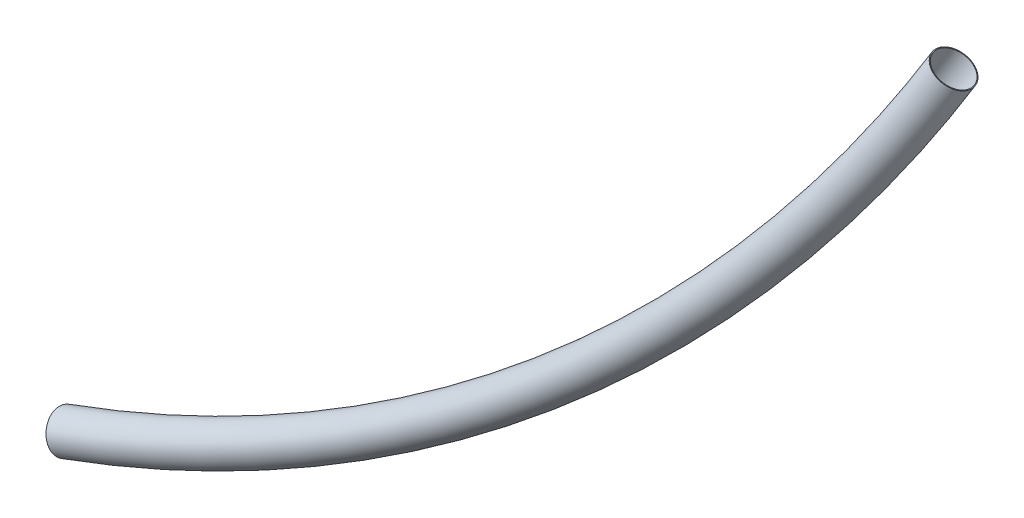
ISO-10303-21;
HEADER;
FILE_DESCRIPTION(('STEP AP214'),'2;1');
FILE_NAME('part.step','',(''),(''),'','','');
FILE_SCHEMA(('AUTOMOTIVE_DESIGN { 1 0 10303 214 1 1 1 1 }'));
ENDSEC;
DATA;
#1=APPLICATION_CONTEXT('core data for automotive mechanical design processes');
#2=APPLICATION_PROTOCOL_DEFINITION('international standard','automotive_design',2000,#1);
#3=PRODUCT_CONTEXT('',#1,'mechanical');
#4=PRODUCT('Part','Part','',(#3));
#5=PRODUCT_RELATED_PRODUCT_CATEGORY('part','',(#4));
#6=PRODUCT_DEFINITION_FORMATION('','',#4);
#7=PRODUCT_DEFINITION_CONTEXT('part definition',#1,'design');
#8=PRODUCT_DEFINITION('design','',#6,#7);
#9=PRODUCT_DEFINITION_SHAPE('','',#8);
#10=(LENGTH_UNIT() NAMED_UNIT(*) SI_UNIT(.MILLI.,.METRE.));
#11=(NAMED_UNIT(*) PLANE_ANGLE_UNIT() SI_UNIT($,.RADIAN.));
#12=(NAMED_UNIT(*) SI_UNIT($,.STERADIAN.) SOLID_ANGLE_UNIT());
#13=UNCERTAINTY_MEASURE_WITH_UNIT(LENGTH_MEASURE(1.E-05),#10,'distance_accuracy_value','');
#14=(GEOMETRIC_REPRESENTATION_CONTEXT(3) GLOBAL_UNCERTAINTY_ASSIGNED_CONTEXT((#13)) GLOBAL_UNIT_ASSIGNED_CONTEXT((#10,
#11,#12)) REPRESENTATION_CONTEXT('',''));
#15=CARTESIAN_POINT('',(0.,0.,0.));
#16=DIRECTION('',(0.,0.,1.));
#17=DIRECTION('',(1.,0.,0.));
#18=AXIS2_PLACEMENT_3D('',#15,#16,#17);
#19=CARTESIAN_POINT('',(3164.51677251035,1114.49605303357,-224.2312287669));
#20=DIRECTION('',(0.941114351142538,0.331446569951202,-0.0666854507455971));
#21=DIRECTION('',(-0.332186000076311,0.943213900106069,0.));
#22=AXIS2_PLACEMENT_3D('',#19,#20,#21);
#23=PLANE('',#22);
#24=CARTESIAN_POINT('',(5217.79586572238,-3918.39079524379,3738.21238905892));
#25=CARTESIAN_POINT('',(5217.55665921907,-3917.55131489414,3739.00899774483));
#26=CARTESIAN_POINT('',(5217.32420216601,-3916.72731941726,3739.82389522538));
#27=CARTESIAN_POINT('',(5216.87316353951,-3915.11163415833,3741.48894227291));
#28=CARTESIAN_POINT('',(5216.65458293209,-3914.31994662677,3742.33909428736));
#29=CARTESIAN_POINT('',(5216.23167087354,-3912.77022378343,3744.07323137316));
#30=CARTESIAN_POINT('',(5216.0273420101,-3912.01219459205,3744.95722254381));
#31=CARTESIAN_POINT('',(5215.63332083363,-3910.53121536967,3746.75741281405));
#32=CARTESIAN_POINT('',(5215.44362987597,-3909.80826858935,3747.67361488474));
#33=CARTESIAN_POINT('',(5215.07905936724,-3908.39810402484,3749.5374647773));
#34=CARTESIAN_POINT('',(5214.90419498258,-3907.71092309718,3750.48514345084));
#35=CARTESIAN_POINT('',(5214.56978849253,-3906.37423876022,3752.40947162517));
#36=CARTESIAN_POINT('',(5214.41024782379,-3905.72473888593,3753.38612383114));
#37=CARTESIAN_POINT('',(5214.10681643023,-3904.46474547891,3755.36641866862));
#38=CARTESIAN_POINT('',(5213.96292320998,-3903.85424573296,3756.37005696452));
#39=CARTESIAN_POINT('',(5213.69100168547,-3902.67317293863,3758.40278338273));
#40=CARTESIAN_POINT('',(5213.56297486656,-3902.10260363057,3759.43187387699));
#41=CARTESIAN_POINT('',(5213.32309411362,-3901.00276367308,3761.51303192115));
#42=CARTESIAN_POINT('',(5213.2112316524,-3900.47347131716,3762.56508701687));
#43=CARTESIAN_POINT('',(5213.00378901596,-3899.45674641698,3764.69092911541));
#44=CARTESIAN_POINT('',(5212.90821036487,-3898.9693177932,3765.76471814196));
#45=CARTESIAN_POINT('',(5212.73352568498,-3898.03728081205,3767.93194052229));
#46=CARTESIAN_POINT('',(5212.6544183764,-3897.59266912937,3769.0253723427));
#47=CARTESIAN_POINT('',(5212.51280166729,-3896.74697742373,3771.23011259891));
#48=CARTESIAN_POINT('',(5212.4502938201,-3896.34590147684,3772.34142269741));
#49=CARTESIAN_POINT('',(5212.34201686091,-3895.58817186547,3774.57948030643));
#50=CARTESIAN_POINT('',(5212.29624193233,-3895.23150279304,3775.70622231103));
#51=CARTESIAN_POINT('',(5212.22147714487,-3894.56304467384,3777.9735225188));
#52=CARTESIAN_POINT('',(5212.19248885653,-3894.25125982842,3779.11408200453));
#53=CARTESIAN_POINT('',(5212.13080980198,-3893.38418690857,3782.55323251197));
#54=CARTESIAN_POINT('',(5212.12337519637,-3892.89697285342,3784.86990896316));
#55=CARTESIAN_POINT('',(5212.17597151394,-3892.1080850363,3789.53319468544));
#56=CARTESIAN_POINT('',(5212.23599215283,-3891.80638300184,3791.87979933973));
#57=CARTESIAN_POINT('',(5212.4230430332,-3891.39043235887,3796.58699826067));
#58=CARTESIAN_POINT('',(5212.55007333091,-3891.27618390765,3798.94759253906));
#59=CARTESIAN_POINT('',(5212.87025002029,-3891.23598445387,3803.66596580989));
#60=CARTESIAN_POINT('',(5213.0633989075,-3891.3100405592,3806.0237446927));
#61=CARTESIAN_POINT('',(5213.51443582229,-3891.64592628545,3810.71965868966));
#62=CARTESIAN_POINT('',(5213.77232383531,-3891.90775586409,3813.05779380822));
#63=CARTESIAN_POINT('',(5214.35096206142,-3892.6172714738,3817.69745988362));
#64=CARTESIAN_POINT('',(5214.67170339615,-3893.06493126535,3819.99899596068));
#65=CARTESIAN_POINT('',(5215.37378784331,-3894.14291170517,3824.54944626565));
#66=CARTESIAN_POINT('',(5215.75513094914,-3894.77323233354,3826.7983604993));
#67=CARTESIAN_POINT('',(5216.57570356685,-3896.21204027504,3831.22758316114));
#68=CARTESIAN_POINT('',(5217.0149329743,-3897.02052726673,3833.4078917131));
#69=CARTESIAN_POINT('',(5217.94815261543,-3898.80990813031,3837.68442046518));
#70=CARTESIAN_POINT('',(5218.44214285907,-3899.7908020336,3839.78064064999));
#71=CARTESIAN_POINT('',(5219.48146018297,-3901.91819725756,3843.87446615381));
#72=CARTESIAN_POINT('',(5220.02679623005,-3903.06472752307,3845.87205415488));
#73=CARTESIAN_POINT('',(5221.16485170614,-3905.51510272457,3849.75403864214));
#74=CARTESIAN_POINT('',(5221.75757113807,-3906.81894767022,3851.63843512138));
#75=CARTESIAN_POINT('',(5222.98617713333,-3909.57467152543,3855.28066160073));
#76=CARTESIAN_POINT('',(5223.62206367696,-3911.02655036744,3857.03849165861));
#77=CARTESIAN_POINT('',(5224.93248297532,-3914.06801399515,3860.41511606687));
#78=CARTESIAN_POINT('',(5225.6070157412,-3915.65759882061,3862.0339103771));
#79=CARTESIAN_POINT('',(5226.99020246938,-3918.9638147838,3865.12158448569));
#80=CARTESIAN_POINT('',(5227.69886959716,-3920.68049508104,3866.59040574752));
#81=CARTESIAN_POINT('',(5229.14504375381,-3924.22814694795,3869.3669965681));
#82=CARTESIAN_POINT('',(5229.88255078925,-3926.05911854363,3870.67476609019));
#83=CARTESIAN_POINT('',(5231.38116523893,-3929.82234089505,3873.11998349902));
#84=CARTESIAN_POINT('',(5232.14227272124,-3931.75459194293,3874.25743089444));
#85=CARTESIAN_POINT('',(5233.68267854666,-3935.70663642623,3876.35393678954));
#86=CARTESIAN_POINT('',(5234.46197689459,-3937.72642988485,3877.31299524195));
#87=CARTESIAN_POINT('',(5236.0335652489,-3941.84008941756,3879.04629704871));
#88=CARTESIAN_POINT('',(5236.82586066394,-3943.93398677182,3879.82046126229));
#89=CARTESIAN_POINT('',(5238.41748721693,-3948.18015364221,3881.1779559637));
#90=CARTESIAN_POINT('',(5239.2168183569,-3950.33242317508,3881.76128639677));
#91=CARTESIAN_POINT('',(5240.81683731912,-3954.68004133252,3882.73297783751));
#92=CARTESIAN_POINT('',(5241.61752514288,-3956.87539000487,3883.12133862889));
#93=CARTESIAN_POINT('',(5243.21456773412,-3961.29356517847,3883.70033591894));
#94=CARTESIAN_POINT('',(5244.01092250107,-3963.51639168311,3883.89097239324));
#95=CARTESIAN_POINT('',(5245.59386101604,-3967.97434897211,3884.07319356518));
#96=CARTESIAN_POINT('',(5246.38044199029,-3970.2094830008,3884.06472299209));
#97=CARTESIAN_POINT('',(5247.93801588649,-3974.67555400033,3883.84865236329));
#98=CARTESIAN_POINT('',(5248.70900880499,-3976.90649097025,3883.64105226352));
#99=CARTESIAN_POINT('',(5250.22992552271,-3981.34830907091,3883.02819258546));
#100=CARTESIAN_POINT('',(5250.97984930776,-3983.55919018816,3882.62293287427));
#101=CARTESIAN_POINT('',(5252.45329447992,-3987.94517531488,3881.6176261962));
#102=CARTESIAN_POINT('',(5253.17681586883,-3990.12027932679,3881.01757924258));
#103=CARTESIAN_POINT('',(5254.59231688713,-3994.41926279779,3879.62694601866));
#104=CARTESIAN_POINT('',(5255.28429621408,-3996.54314176562,3878.8363579218));
#105=CARTESIAN_POINT('',(5256.63178224244,-4000.72454549194,3877.0702532903));
#106=CARTESIAN_POINT('',(5257.28728894169,-4002.78207024649,3876.09473674464));
#107=CARTESIAN_POINT('',(5258.55716348997,-4006.81612327564,3873.96569845536));
#108=CARTESIAN_POINT('',(5259.17153136712,-4008.7926516056,3872.81217683342));
#109=CARTESIAN_POINT('',(5260.35475391683,-4012.65064365586,3870.33531706893));
#110=CARTESIAN_POINT('',(5260.92360859969,-4014.53210739766,3869.01197896482));
#111=CARTESIAN_POINT('',(5262.01161266959,-4018.18610371434,3866.20524527103));
#112=CARTESIAN_POINT('',(5262.53077476821,-4019.95866410539,3864.72189082186));
#113=CARTESIAN_POINT('',(5263.51586033485,-4023.38275753947,3861.60538103261));
#114=CARTESIAN_POINT('',(5263.98178380947,-4025.03429059749,3859.97222571109));
#115=CARTESIAN_POINT('',(5264.85707058478,-4028.20456300455,3856.5677204258));
#116=CARTESIAN_POINT('',(5265.26643396903,-4029.72330254974,3854.79637066616));
#117=CARTESIAN_POINT('',(5266.02568197797,-4032.61716795099,3851.12806579413));
#118=CARTESIAN_POINT('',(5266.37556661958,-4033.99229384796,3849.23111071751));
#119=CARTESIAN_POINT('',(5267.01323057268,-4036.58859962467,3845.32588185789));
#120=CARTESIAN_POINT('',(5267.30103514257,-4037.80984203029,3843.31765376792));
#121=CARTESIAN_POINT('',(5267.81266642704,-4040.09033371745,3839.20344894313));
#122=CARTESIAN_POINT('',(5268.03649315767,-4041.14958303961,3837.09747223281));
#123=CARTESIAN_POINT('',(5268.41857057687,-4043.09853684426,3832.80274965267));
#124=CARTESIAN_POINT('',(5268.57682138856,-4043.98824164506,3830.61400393824));
#125=CARTESIAN_POINT('',(5268.82661678783,-4045.59176566423,3826.16930876747));
#126=CARTESIAN_POINT('',(5268.91816139022,-4046.30558492166,3823.91335932606));
#127=CARTESIAN_POINT('',(5269.03386696618,-4047.55200882966,3819.3511835056));
#128=CARTESIAN_POINT('',(5269.05805376328,-4048.08468285862,3817.04497673598));
#129=CARTESIAN_POINT('',(5269.03894289065,-4048.96539869367,3812.39784972914));
#130=CARTESIAN_POINT('',(5268.99564523908,-4049.31344054943,3810.05692950125));
#131=CARTESIAN_POINT('',(5268.84187193052,-4049.82241225028,3805.35702587234));
#132=CARTESIAN_POINT('',(5268.73139632919,-4049.98334225038,3802.9980424863));
#133=CARTESIAN_POINT('',(5268.44405255539,-4050.11694514484,3798.27878863386));
#134=CARTESIAN_POINT('',(5268.26718438725,-4050.08961805144,3795.91851816755));
#135=CARTESIAN_POINT('',(5267.84835547657,-4049.84692744374,3791.2139397996));
#136=CARTESIAN_POINT('',(5267.6064075266,-4049.63160086537,3788.86962885358));
#137=CARTESIAN_POINT('',(5267.05912554412,-4049.01449790838,3784.21316682228));
#138=CARTESIAN_POINT('',(5266.75379152263,-4048.6127215622,3781.9010157314));
#139=CARTESIAN_POINT('',(5266.08191128536,-4047.6255845576,3777.32531059808));
#140=CARTESIAN_POINT('',(5265.71536514651,-4047.04022412989,3775.06175649457));
#141=CARTESIAN_POINT('',(5264.92366952792,-4045.69009088041,3770.59932772573));
#142=CARTESIAN_POINT('',(5264.49852004137,-4044.92531803777,3768.40045306792));
#143=CARTESIAN_POINT('',(5263.59261081217,-4043.22174699156,3764.08284865379));
#144=CARTESIAN_POINT('',(5263.11184704444,-4042.28293618903,3761.96412471314));
#145=CARTESIAN_POINT('',(5262.09815552184,-4040.23801287565,3757.82203946922));
#146=CARTESIAN_POINT('',(5261.56522776715,-4039.13190036537,3755.79867816564));
#147=CARTESIAN_POINT('',(5260.45099835906,-4036.76024583192,3751.86167956609));
#148=CARTESIAN_POINT('',(5259.86969657396,-4035.49470337468,3749.94804256887));
#149=CARTESIAN_POINT('',(5258.66285475245,-4032.81319792177,3746.24408060497));
#150=CARTESIAN_POINT('',(5258.03731470487,-4031.39723488811,3744.45375566942));
#151=CARTESIAN_POINT('',(5256.74624303329,-4028.42449858812,3741.00858395789));
#152=CARTESIAN_POINT('',(5256.08069903616,-4026.86768168,3739.35377947585));
#153=CARTESIAN_POINT('',(5254.71452860915,-4023.62468935022,3736.19201167612));
#154=CARTESIAN_POINT('',(5254.01390217338,-4021.93851390679,3734.6850483833));
#155=CARTESIAN_POINT('',(5252.58254483686,-4018.44878954838,3731.82964648971));
#156=CARTESIAN_POINT('',(5251.85181382504,-4016.64524020026,3730.48120847397));
#157=CARTESIAN_POINT('',(5250.36544265927,-4012.93359493525,3727.95242383837));
#158=CARTESIAN_POINT('',(5249.6098024988,-4011.02549899093,3726.77207726262));
#159=CARTESIAN_POINT('',(5248.07864300981,-4007.11745640241,3724.5873599644));
#160=CARTESIAN_POINT('',(5247.30311507643,-4005.11746969299,3723.58306693974));
#161=CARTESIAN_POINT('',(5245.73801478032,-4001.04065195217,3721.75821471527));
#162=CARTESIAN_POINT('',(5244.94844241107,-3998.96382088505,3720.93765560088));
#163=CARTESIAN_POINT('',(5243.36088378942,-3994.74812612301,3719.48611508947));
#164=CARTESIAN_POINT('',(5242.56289785091,-3992.60926473709,3718.85512664584));
#165=CARTESIAN_POINT('',(5240.96418944627,-3988.28473797166,3717.78715966001));
#166=CARTESIAN_POINT('',(5240.1634669824,-3986.09907263071,3717.35018095797));
#167=CARTESIAN_POINT('',(5238.56464022608,-3981.69553685328,3716.67324204897));
#168=CARTESIAN_POINT('',(5237.76653661871,-3979.47765870375,3716.43332984639));
#169=CARTESIAN_POINT('',(5236.57602089142,-3976.13968267099,3716.22262827033));
#170=CARTESIAN_POINT('',(5236.18023535216,-3975.02501125981,3716.17725952676));
#171=CARTESIAN_POINT('',(5235.39152460667,-3972.7937750023,3716.13630010989));
#172=CARTESIAN_POINT('',(5234.99859913653,-3971.67721034269,3716.14070478407));
#173=CARTESIAN_POINT('',(5234.21616766826,-3969.4437737289,3716.19929959328));
#174=CARTESIAN_POINT('',(5233.82666291276,-3968.32690180365,3716.25350712157));
#175=CARTESIAN_POINT('',(5233.05193160736,-3966.09530570706,3716.41162439945));
#176=CARTESIAN_POINT('',(5232.6667046609,-3964.98058134469,3716.51552950189));
#177=CARTESIAN_POINT('',(5231.90114966703,-3962.75507797387,3716.77286700444));
#178=CARTESIAN_POINT('',(5231.52082200284,-3961.64429927892,3716.92630325461));
#179=CARTESIAN_POINT('',(5230.76580721446,-3959.42885169226,3717.28241167968));
#180=CARTESIAN_POINT('',(5230.39111956618,-3958.32418223896,3717.48507924934));
#181=CARTESIAN_POINT('',(5229.64776610637,-3956.12207597441,3717.93945061091));
#182=CARTESIAN_POINT('',(5229.27910449483,-3955.02464450114,3718.19118714494));
#183=CARTESIAN_POINT('',(5228.54875108693,-3952.83981846927,3718.7431369362));
#184=CARTESIAN_POINT('',(5228.18705864176,-3951.75242298132,3719.0433456562));
#185=CARTESIAN_POINT('',(5227.47119486223,-3949.58932769875,3719.69177548646));
#186=CARTESIAN_POINT('',(5227.11702474194,-3948.51362980554,3720.04000428));
#187=CARTESIAN_POINT('',(5226.41692925554,-3946.37612328186,3720.78378415323));
#188=CARTESIAN_POINT('',(5226.07100311972,-3945.31431335894,3721.17933079413));
#189=CARTESIAN_POINT('',(5225.38832380017,-3943.2074398719,3722.01664515749));
#190=CARTESIAN_POINT('',(5225.05156167186,-3942.16236042066,3722.45836561128));
#191=CARTESIAN_POINT('',(5224.38747620881,-3940.08980270495,3723.38753060221));
#192=CARTESIAN_POINT('',(5224.06015200304,-3939.06232281979,3723.87497090209));
#193=CARTESIAN_POINT('',(5223.4155490128,-3937.02687153555,3724.89465691752));
#194=CARTESIAN_POINT('',(5223.09826841229,-3936.01889662263,3725.42689446864));
#195=CARTESIAN_POINT('',(5222.47428249386,-3934.02414488873,3726.53525493616));
#196=CARTESIAN_POINT('',(5222.16757643973,-3933.0373665938,3727.11137478837));
#197=CARTESIAN_POINT('',(5221.48982875125,-3930.84238800778,3728.45619658036));
#198=CARTESIAN_POINT('',(5221.12190718842,-3929.64061230671,3729.23699914697));
#199=CARTESIAN_POINT('',(5220.40452058421,-3927.2764415226,3730.86334293585));
#200=CARTESIAN_POINT('',(5220.05505147543,-3926.11403778141,3731.70886978975));
#201=CARTESIAN_POINT('',(5219.37544526724,-3923.83153565822,3733.46248084994));
#202=CARTESIAN_POINT('',(5219.04530817169,-3922.7114372847,3734.37056506873));
#203=CARTESIAN_POINT('',(5218.4052087608,-3920.51639893177,3736.24700422966));
#204=CARTESIAN_POINT('',(5218.09525092579,-3919.44146899962,3737.21537246372));
#205=CARTESIAN_POINT('',(5217.79586572238,-3918.39079524379,3738.21238905892));
#206=B_SPLINE_CURVE_WITH_KNOTS('',3,(#24,#25,#26,#27,#28,#29,#30,#31,#32,#33,#34,#35,#36,#37,
#38,#39,#40,#41,#42,#43,#44,#45,#46,#47,#48,#49,#50,#51,#52,#53,#54,#55,#56,#57,#58,#59,#60,#61,
#62,#63,#64,#65,#66,#67,#68,#69,#70,#71,#72,#73,#74,#75,#76,#77,#78,#79,#80,#81,#82,#83,#84,#85,
#86,#87,#88,#89,#90,#91,#92,#93,#94,#95,#96,#97,#98,#99,#100,#101,#102,#103,#104,#105,#106,#107,
#108,#109,#110,#111,#112,#113,#114,#115,#116,#117,#118,#119,#120,#121,#122,#123,#124,#125,#126,
#127,#128,#129,#130,#131,#132,#133,#134,#135,#136,#137,#138,#139,#140,#141,#142,#143,#144,#145,
#146,#147,#148,#149,#150,#151,#152,#153,#154,#155,#156,#157,#158,#159,#160,#161,#162,#163,#164,
#165,#166,#167,#168,#169,#170,#171,#172,#173,#174,#175,#176,#177,#178,#179,#180,#181,#182,#183,
#184,#185,#186,#187,#188,#189,#190,#191,#192,#193,#194,#195,#196,#197,#198,#199,#200,#201,#202,
#203,#204,#205),.UNSPECIFIED.,.T.,.F.,(4,2,2,2,2,2,2,2,2,2,2,2,2,2,2,2,2,2,2,2,2,2,2,2,2,2,2,2,
2,2,2,2,2,2,2,2,2,2,2,2,2,2,2,2,2,2,2,2,2,2,2,2,2,2,2,2,2,2,2,2,2,2,2,2,2,2,2,2,2,2,2,2,2,2,2,2,
2,2,2,2,2,2,2,2,2,2,2,2,2,2,4),(0.,3.54492154294891,7.09008959784719,10.635899685164,
14.182037697725,17.7317604333132,21.2818156451913,24.8313038696443,28.3811241347157,
31.929064873589,35.4773375105838,39.0253343548696,42.5736630980589,46.1207572190253,
49.6681831470842,56.7610964849581,63.852928577248,70.9447666197537,78.0368723601111,
85.1289765036571,92.2200795713719,99.311181866797,106.402271368987,113.493362163145,
120.585693623103,127.678025518775,134.770354177893,141.862684884871,148.957773326899,
156.052863383852,163.147973907437,170.243086311613,177.341230234958,184.439376195045,
191.537530029716,198.635684739779,205.735809871579,212.835936574646,219.936068051383,
227.036199044697,234.136398103403,241.236597585007,248.336792213215,255.436985234755,
262.535357115072,269.633728116278,276.732088632147,283.830447126461,290.925912054251,
298.021375202569,305.116825029331,312.21227327999,319.305000914151,326.397726640301,
333.49044649038,340.583165878783,347.67449208627,354.765817060491,361.857133122928,
368.948450010046,376.040280453103,383.132110872512,390.223960600343,397.315812118747,
404.409868532177,411.503926139097,418.59800992554,425.692095572978,432.789304217427,
439.88651616137,446.983464259487,454.08040651083,461.179077028603,464.729381764132,
468.279354640779,471.830567789667,475.381448934813,478.932606156939,482.483431321978,
486.036633999073,489.589504272217,493.142943670423,496.696049989183,500.245553927949,
503.794729227145,507.343259073639,510.891541362548,515.328281024785,519.764038599301,
524.199797060917,528.636537043195),.UNSPECIFIED.);
#207=CARTESIAN_POINT('',(5217.79586572238,-3918.39079524379,3738.21238905892));
#208=VERTEX_POINT('',#207);
#209=EDGE_CURVE('E48',#208,#208,#206,.T.);
#210=ORIENTED_EDGE('',*,*,#209,.F.);
#211=EDGE_LOOP('',(#210));
#212=FACE_BOUND('',#211,.T.);
#213=CARTESIAN_POINT('',(5253.0167935195,-4018.7564288186,3736.42902585758));
#214=CARTESIAN_POINT('',(5252.67509751261,-4017.9257419912,3735.73552051793));
#215=CARTESIAN_POINT('',(5252.32973463157,-4017.08084309017,3735.06090378385));
#216=CARTESIAN_POINT('',(5251.63223805039,-4015.36400007823,3733.75053826942));
#217=CARTESIAN_POINT('',(5251.28010387749,-4014.49205407632,3733.114792216));
#218=CARTESIAN_POINT('',(5250.56965614222,-4012.72257848398,3731.88325006132));
#219=CARTESIAN_POINT('',(5250.21134146149,-4011.8250442437,3731.2874612878));
#220=CARTESIAN_POINT('',(5249.48919707584,-4010.00605195858,3730.13696008551));
#221=CARTESIAN_POINT('',(5249.12536686332,-4009.08459170614,3729.58225146541));
#222=CARTESIAN_POINT('',(5248.39249755078,-4007.21851573957,3728.51441210378));
#223=CARTESIAN_POINT('',(5248.023453518,-4006.27387737403,3728.00132433178));
#224=CARTESIAN_POINT('',(5247.28114255716,-4004.36394393872,3727.01822214737));
#225=CARTESIAN_POINT('',(5246.90787523655,-4003.39864694125,3726.54821177642));
#226=CARTESIAN_POINT('',(5246.15787667593,-4001.44935790313,3725.6522255825));
#227=CARTESIAN_POINT('',(5245.78114600097,-4000.46536888511,3725.22624271051));
#228=CARTESIAN_POINT('',(5245.02479696056,-3998.48020465033,3724.41894427596));
#229=CARTESIAN_POINT('',(5244.64517832824,-3997.47902783423,3724.03763289623));
#230=CARTESIAN_POINT('',(5243.88397708147,-3995.461924878,3723.32060150745));
#231=CARTESIAN_POINT('',(5243.5023956845,-3994.44600730211,3722.98485611346));
#232=CARTESIAN_POINT('',(5242.73770119882,-3992.4005869368,3722.35927152114));
#233=CARTESIAN_POINT('',(5242.35458797021,-3991.37108288574,3722.06943661901));
#234=CARTESIAN_POINT('',(5241.58757580368,-3989.30049247419,3721.53624583546));
#235=CARTESIAN_POINT('',(5241.20367692914,-3988.25940701984,3721.29288634448));
#236=CARTESIAN_POINT('',(5240.43571273949,-3986.16733512478,3720.8530292841));
#237=CARTESIAN_POINT('',(5240.05164741217,-3985.11634776742,3720.65653609844));
#238=CARTESIAN_POINT('',(5239.28419434392,-3983.00678028459,3720.3108506477));
#239=CARTESIAN_POINT('',(5238.90080641326,-3981.94820293753,3720.16164189563));
#240=CARTESIAN_POINT('',(5238.1352519529,-3979.82496807958,3719.91068193103));
#241=CARTESIAN_POINT('',(5237.75308554069,-3978.76031000977,3719.80893515468));
#242=CARTESIAN_POINT('',(5236.60951546822,-3975.56025821082,3719.57524078606));
#243=CARTESIAN_POINT('',(5235.85083109412,-3973.41820996752,3719.51474468835));
#244=CARTESIAN_POINT('',(5234.34638686682,-3969.13234629982,3719.58493629807));
#245=CARTESIAN_POINT('',(5233.60063077861,-3966.98853054495,3719.71567878223));
#246=CARTESIAN_POINT('',(5232.12743373816,-3962.71461365709,3720.16747472237));
#247=CARTESIAN_POINT('',(5231.39999280702,-3960.58451253991,3720.48852839746));
#248=CARTESIAN_POINT('',(5229.96860634058,-3956.35318588951,3721.31869987258));
#249=CARTESIAN_POINT('',(5229.26466173698,-3954.2519615033,3721.82782512069));
#250=CARTESIAN_POINT('',(5227.88529531005,-3950.09339052011,3723.03052447282));
#251=CARTESIAN_POINT('',(5227.20987347928,-3948.03604391169,3723.72409852876));
#252=CARTESIAN_POINT('',(5225.8923810957,-3943.97993323771,3725.29075181449));
#253=CARTESIAN_POINT('',(5225.25030947752,-3941.9811673017,3726.1638253058));
#254=CARTESIAN_POINT('',(5224.00406272111,-3938.05636726014,3728.08329653315));
#255=CARTESIAN_POINT('',(5223.39988758514,-3936.13033315898,3729.12969427963));
#256=CARTESIAN_POINT('',(5222.23373692049,-3932.36471002557,3731.38838404641));
#257=CARTESIAN_POINT('',(5221.67176127437,-3930.52512075279,3732.60067560508));
#258=CARTESIAN_POINT('',(5220.59401045487,-3926.94547880954,3735.18254734232));
#259=CARTESIAN_POINT('',(5220.07823527021,-3925.20542611475,3736.55212748245));
#260=CARTESIAN_POINT('',(5219.09669921253,-3921.8377256865,3739.43844051424));
#261=CARTESIAN_POINT('',(5218.63092428674,-3920.21004641618,3740.95513183037));
#262=CARTESIAN_POINT('',(5217.75254132195,-3917.07814655553,3744.12521840732));
#263=CARTESIAN_POINT('',(5217.33993327539,-3915.57392594762,3745.77861364867));
#264=CARTESIAN_POINT('',(5216.57082735539,-3912.69966568554,3749.21035300995));
#265=CARTESIAN_POINT('',(5216.21432928688,-3911.32962556491,3750.98869669548));
#266=CARTESIAN_POINT('',(5215.55998505296,-3908.73348595872,3754.6576951909));
#267=CARTESIAN_POINT('',(5215.26213886996,-3907.50738643001,3756.54834996712));
#268=CARTESIAN_POINT('',(5214.72734007047,-3905.20836699428,3760.42768613654));
#269=CARTESIAN_POINT('',(5214.49036124288,-3904.13538124117,3762.41632489406));
#270=CARTESIAN_POINT('',(5214.07882074842,-3902.14960852589,3766.47824374952));
#271=CARTESIAN_POINT('',(5213.90425906478,-3901.23682152069,3768.55152382473));
#272=CARTESIAN_POINT('',(5213.61880001218,-3899.57795428346,3772.76797946196));
#273=CARTESIAN_POINT('',(5213.50790259415,-3898.83187392295,3774.91115497012));
#274=CARTESIAN_POINT('',(5213.35056524982,-3897.51173927791,3779.25215685298));
#275=CARTESIAN_POINT('',(5213.30412530951,-3896.93768495601,3781.44998321583));
#276=CARTESIAN_POINT('',(5213.27604197502,-3895.96588424188,3785.8837897052));
#277=CARTESIAN_POINT('',(5213.2943735196,-3895.56806972635,3788.11975474201));
#278=CARTESIAN_POINT('',(5213.39564918688,-3894.95125871157,3792.61476640808));
#279=CARTESIAN_POINT('',(5213.4785932916,-3894.73226216255,3794.87381303092));
#280=CARTESIAN_POINT('',(5213.70850475284,-3894.47464678347,3799.3989186732));
#281=CARTESIAN_POINT('',(5213.85547200875,-3894.43602766996,3801.66497768163));
#282=CARTESIAN_POINT('',(5214.21238404418,-3894.53943962586,3806.18799577915));
#283=CARTESIAN_POINT('',(5214.42232882133,-3894.68147068848,3808.44495486857));
#284=CARTESIAN_POINT('',(5214.90366119919,-3895.14512948985,3812.93335054978));
#285=CARTESIAN_POINT('',(5215.17503861194,-3895.4667274623,3815.16479130911));
#286=CARTESIAN_POINT('',(5215.77732382554,-3896.28720456326,3819.58666945295));
#287=CARTESIAN_POINT('',(5216.10823161694,-3896.78608366362,3821.77710684398));
#288=CARTESIAN_POINT('',(5216.8272219043,-3897.95756604893,3826.10141231359));
#289=CARTESIAN_POINT('',(5217.21530440943,-3898.63016936171,3828.2352803831));
#290=CARTESIAN_POINT('',(5218.04588166294,-3900.14430660455,3832.43128677283));
#291=CARTESIAN_POINT('',(5218.48837641996,-3900.98584056147,3834.49342508163));
#292=CARTESIAN_POINT('',(5219.42468989333,-3902.83196413436,3838.53158809921));
#293=CARTESIAN_POINT('',(5219.91851526468,-3903.83657490276,3840.50760159465));
#294=CARTESIAN_POINT('',(5220.95392817308,-3906.00161927906,3844.35919759141));
#295=CARTESIAN_POINT('',(5221.49551571162,-3907.16205289185,3846.23478008958));
#296=CARTESIAN_POINT('',(5222.62260079739,-3909.63048334371,3849.8722023464));
#297=CARTESIAN_POINT('',(5223.20809839512,-3910.93848035246,3851.63404197423));
#298=CARTESIAN_POINT('',(5224.41883950473,-3913.69272959538,3855.03147525069));
#299=CARTESIAN_POINT('',(5225.04408302781,-3915.13898186848,3856.66706886376));
#300=CARTESIAN_POINT('',(5226.33010637635,-3918.1600076379,3859.80098185186));
#301=CARTESIAN_POINT('',(5226.99089909143,-3919.73482785963,3861.29925089537));
#302=CARTESIAN_POINT('',(5228.34311303753,-3923.00132832739,3864.14721207107));
#303=CARTESIAN_POINT('',(5229.03453427487,-3924.69300859752,3865.49690417262));
#304=CARTESIAN_POINT('',(5230.44309197577,-3928.18120359079,3868.03814216375));
#305=CARTESIAN_POINT('',(5231.16022848699,-3929.97771850824,3869.2296877602));
#306=CARTESIAN_POINT('',(5232.61512008227,-3933.66281132557,3871.44618301914));
#307=CARTESIAN_POINT('',(5233.35287517204,-3935.55138925094,3872.4711326355));
#308=CARTESIAN_POINT('',(5234.84408768923,-3939.40802826321,3874.34757985116));
#309=CARTESIAN_POINT('',(5235.5975517982,-3941.37612351947,3875.19900191337));
#310=CARTESIAN_POINT('',(5237.11451669479,-3945.3770372157,3876.72179754481));
#311=CARTESIAN_POINT('',(5237.87801748529,-3947.40985567421,3877.39317106246));
#312=CARTESIAN_POINT('',(5239.40963165441,-3951.52577207238,3878.55111033895));
#313=CARTESIAN_POINT('',(5240.17774503986,-3953.60887008652,3879.03767582406));
#314=CARTESIAN_POINT('',(5241.71312619796,-3957.81054181503,3879.82254807586));
#315=CARTESIAN_POINT('',(5242.48039397048,-3959.92911553473,3880.12085481427));
#316=CARTESIAN_POINT('',(5244.00887073985,-3964.18734926622,3880.52715721423));
#317=CARTESIAN_POINT('',(5244.77007778155,-3966.32701562079,3880.63509375805));
#318=CARTESIAN_POINT('',(5246.28078094625,-3970.61157665381,3880.65970738003));
#319=CARTESIAN_POINT('',(5247.03027706646,-3972.75647133353,3880.5763844125));
#320=CARTESIAN_POINT('',(5248.51223117368,-3977.03624437988,3880.21906781539));
#321=CARTESIAN_POINT('',(5249.24468914157,-3979.17112273527,3879.94507397161));
#322=CARTESIAN_POINT('',(5250.68735844823,-3983.41568355057,3879.20835652903));
#323=CARTESIAN_POINT('',(5251.39756978785,-3985.52536601144,3878.74563293742));
#324=CARTESIAN_POINT('',(5252.79073316646,-3989.70464813016,3877.63470584331));
#325=CARTESIAN_POINT('',(5253.4736837279,-3991.77424561227,3876.98649230276));
#326=CARTESIAN_POINT('',(5254.80742642963,-3995.85852022298,3875.50919235159));
#327=CARTESIAN_POINT('',(5255.4582185671,-3997.87319734676,3874.68010592515));
#328=CARTESIAN_POINT('',(5256.72301213112,-4001.83329450061,3872.84694377942));
#329=CARTESIAN_POINT('',(5257.33701361368,-4003.77871463609,3871.84286832652));
#330=CARTESIAN_POINT('',(5258.52385570384,-4007.5864554402,3869.66685386495));
#331=CARTESIAN_POINT('',(5259.09669632002,-4009.44877612615,3868.4949148913));
#332=CARTESIAN_POINT('',(5260.1970150442,-4013.07665784712,3865.99177202313));
#333=CARTESIAN_POINT('',(5260.72450315969,-4014.84224019707,3864.66060342006));
#334=CARTESIAN_POINT('',(5261.73050173117,-4018.26452016331,3861.8482468823));
#335=CARTESIAN_POINT('',(5262.20901219188,-4019.92121779011,3860.36705896209));
#336=CARTESIAN_POINT('',(5263.11364572993,-4023.11392979729,3857.265185373));
#337=CARTESIAN_POINT('',(5263.53976878734,-4024.64994413179,3855.64449965109));
#338=CARTESIAN_POINT('',(5264.33658905403,-4027.59034452082,3852.27514947872));
#339=CARTESIAN_POINT('',(5264.70728627904,-4028.99473061272,3850.52648506459));
#340=CARTESIAN_POINT('',(5265.39047461654,-4031.66133407482,3846.91432950017));
#341=CARTESIAN_POINT('',(5265.70298880479,-4032.92360772887,3845.05088426459));
#342=CARTESIAN_POINT('',(5266.26776424487,-4035.29763584044,3841.22178511539));
#343=CARTESIAN_POINT('',(5266.52002551096,-4036.40939033357,3839.25613122595));
#344=CARTESIAN_POINT('',(5266.96249486912,-4038.47445665207,3835.23659050032));
#345=CARTESIAN_POINT('',(5267.15270294472,-4039.42776843534,3833.18270364068));
#346=CARTESIAN_POINT('',(5267.46970738093,-4041.16915237682,3829.00130714472));
#347=CARTESIAN_POINT('',(5267.59650375787,-4041.95722457757,3826.87379752734));
#348=CARTESIAN_POINT('',(5267.78574199997,-4043.3622420103,3822.5611119242));
#349=CARTESIAN_POINT('',(5267.84820833416,-4043.97925224329,3820.37595818896));
#350=CARTESIAN_POINT('',(5267.90842484713,-4045.03814732004,3815.96275390963));
#351=CARTESIAN_POINT('',(5267.90617503099,-4045.48003217756,3813.73470336889));
#352=CARTESIAN_POINT('',(5267.83697118962,-4046.1855094733,3809.25161515745));
#353=CARTESIAN_POINT('',(5267.77001977306,-4046.44910909896,3806.99657857839));
#354=CARTESIAN_POINT('',(5267.57190397821,-4046.79618010127,3802.47557575689));
#355=CARTESIAN_POINT('',(5267.44073967104,-4046.87965167745,3800.20960952657));
#356=CARTESIAN_POINT('',(5267.11514114547,-4046.8658255027,3795.68324277714));
#357=CARTESIAN_POINT('',(5266.92072842434,-4046.76858911909,3793.42284062953));
#358=CARTESIAN_POINT('',(5266.58278136955,-4046.48788520816,3790.0486642204));
#359=CARTESIAN_POINT('',(5266.46239145183,-4046.37181733037,3788.92652470593));
#360=CARTESIAN_POINT('',(5266.20637205939,-4046.09493923002,3786.68955658053));
#361=CARTESIAN_POINT('',(5266.07074400997,-4045.93413319,3785.57472729615));
#362=CARTESIAN_POINT('',(5265.78443744672,-4045.5679962457,3783.35396730247));
#363=CARTESIAN_POINT('',(5265.6337537074,-4045.36264985327,3782.24803982772));
#364=CARTESIAN_POINT('',(5265.31765654798,-4044.90785284432,3780.0475198823));
#365=CARTESIAN_POINT('',(5265.15224450631,-4044.65840635292,3778.95292636159));
#366=CARTESIAN_POINT('',(5264.80696031777,-4044.1158197782,3776.77683780942));
#367=CARTESIAN_POINT('',(5264.62708704766,-4043.8226762993,3775.69534380298));
#368=CARTESIAN_POINT('',(5264.25322929359,-4043.1932622574,3773.54756237866));
#369=CARTESIAN_POINT('',(5264.05924613036,-4042.85699572865,3772.48127354867));
#370=CARTESIAN_POINT('',(5263.65738304207,-4042.14170690834,3770.3650834055));
#371=CARTESIAN_POINT('',(5263.44949515083,-4041.76266002041,3769.31519191881));
#372=CARTESIAN_POINT('',(5263.02031340351,-4040.96268169928,3767.23439274113));
#373=CARTESIAN_POINT('',(5262.79902080261,-4040.54175418529,3766.20348328446));
#374=CARTESIAN_POINT('',(5262.34336992286,-4039.65866508893,3764.16221748241));
#375=CARTESIAN_POINT('',(5262.10900955926,-4039.19649692022,3763.15186445175));
#376=CARTESIAN_POINT('',(5261.62769568373,-4038.2318536042,3761.15377227646));
#377=CARTESIAN_POINT('',(5261.38074335286,-4037.72938223459,3760.16603102351));
#378=CARTESIAN_POINT('',(5260.87492187443,-4036.68552019208,3758.21581013548));
#379=CARTESIAN_POINT('',(5260.61606506387,-4036.14416949816,3757.25330590178));
#380=CARTESIAN_POINT('',(5260.08668780205,-4035.0231151702,3755.35431706495));
#381=CARTESIAN_POINT('',(5259.81616843136,-4034.44341508673,3754.41783006439));
#382=CARTESIAN_POINT('',(5259.26397298556,-4033.24675298882,3752.57260731258));
#383=CARTESIAN_POINT('',(5258.98229895013,-4032.62979777591,3751.66386654115));
#384=CARTESIAN_POINT('',(5258.40827502873,-4031.35968640385,3749.87564900233));
#385=CARTESIAN_POINT('',(5258.11592588948,-4030.70653277514,3748.99617019626));
#386=CARTESIAN_POINT('',(5257.44717258358,-4029.19855192832,3747.05334379449));
#387=CARTESIAN_POINT('',(5257.0679213311,-4028.33391718031,3745.99856236722));
#388=CARTESIAN_POINT('',(5256.29469420682,-4026.55256263964,3743.94007300502));
#389=CARTESIAN_POINT('',(5255.90072161625,-4025.63585443013,3742.93635380531));
#390=CARTESIAN_POINT('',(5255.0990553708,-4023.75270076615,3740.9824825433));
#391=CARTESIAN_POINT('',(5254.69136171784,-4022.78625531865,3740.03233047348));
#392=CARTESIAN_POINT('',(5253.86327907735,-4020.80605641128,3738.18799531716));
#393=CARTESIAN_POINT('',(5253.44288729424,-4019.79229250672,3737.29382469052));
#394=CARTESIAN_POINT('',(5253.0167935195,-4018.7564288186,3736.42902585758));
#395=B_SPLINE_CURVE_WITH_KNOTS('',3,(#213,#214,#215,#216,#217,#218,#219,#220,#221,#222,#223,
#224,#225,#226,#227,#228,#229,#230,#231,#232,#233,#234,#235,#236,#237,#238,#239,#240,#241,#242,
#243,#244,#245,#246,#247,#248,#249,#250,#251,#252,#253,#254,#255,#256,#257,#258,#259,#260,#261,
#262,#263,#264,#265,#266,#267,#268,#269,#270,#271,#272,#273,#274,#275,#276,#277,#278,#279,#280,
#281,#282,#283,#284,#285,#286,#287,#288,#289,#290,#291,#292,#293,#294,#295,#296,#297,#298,#299,
#300,#301,#302,#303,#304,#305,#306,#307,#308,#309,#310,#311,#312,#313,#314,#315,#316,#317,#318,
#319,#320,#321,#322,#323,#324,#325,#326,#327,#328,#329,#330,#331,#332,#333,#334,#335,#336,#337,
#338,#339,#340,#341,#342,#343,#344,#345,#346,#347,#348,#349,#350,#351,#352,#353,#354,#355,#356,
#357,#358,#359,#360,#361,#362,#363,#364,#365,#366,#367,#368,#369,#370,#371,#372,#373,#374,#375,
#376,#377,#378,#379,#380,#381,#382,#383,#384,#385,#386,#387,#388,#389,#390,#391,#392,#393,#394),
.UNSPECIFIED.,.T.,.F.,(4,2,2,2,2,2,2,2,2,2,2,2,2,2,2,2,2,2,2,2,2,2,2,2,2,2,2,2,2,2,2,2,2,2,2,2,
2,2,2,2,2,2,2,2,2,2,2,2,2,2,2,2,2,2,2,2,2,2,2,2,2,2,2,2,2,2,2,2,2,2,2,2,2,2,2,2,2,2,2,2,2,2,2,2,
2,2,2,2,2,2,4),(0.,3.40405361191172,6.80834575795984,10.2132605173641,13.6184905642936,
17.0271925899133,20.4362140890201,23.8446889393336,27.2534826885883,30.6603695240218,
34.0675749801449,37.4745157044388,40.8817749798322,44.2878449125102,47.694233141467,
54.505152104536,61.3180223104588,68.1309003603841,74.9440482455427,81.7571943542894,
88.5701226854498,95.3830514269983,102.195961210613,109.008869329225,115.8198576115,
122.630844923886,129.441808557919,136.25277015026,143.060793825611,149.868815672072,
156.676832271427,163.484847391716,170.290228658044,177.09560803071,183.900976709506,
190.706345132714,197.510585783708,204.314825354275,211.1190660148,217.923307757559,
224.728432773404,231.533558002722,238.33869105798,245.143826029566,251.951445294436,
258.759065963247,265.566699249791,272.374334421568,279.184926678593,285.995520886268,
292.80612518085,299.616730498,306.429450414633,313.242171958821,320.054901156111,
326.867630093969,333.680727781932,340.493826065467,347.306913976917,354.1200004666,
360.931579700915,367.743158278338,374.554739445448,381.366318679308,388.175190615777,
394.98406094129,401.792933075851,408.601803457496,415.40808301268,422.214362033669,
429.020366648253,435.826363724381,442.630049947684,446.032820899121,449.43527383494,
452.838911817647,456.242231591926,459.645815968115,463.049082165186,466.454315118798,
469.859229709122,473.264689059091,476.669829580379,480.07151744449,483.472890802542,
486.873645050387,490.274161869456,494.519005214001,498.76290801117,503.006810213163,
507.251653652005),.UNSPECIFIED.);
#396=CARTESIAN_POINT('',(5253.0167935195,-4018.7564288186,3736.42902585758));
#397=VERTEX_POINT('',#396);
#398=EDGE_CURVE('E12',#397,#397,#395,.T.);
#399=ORIENTED_EDGE('',*,*,#398,.T.);
#400=EDGE_LOOP('',(#399));
#401=FACE_BOUND('',#400,.T.);
#402=ADVANCED_FACE('F37',(#212,#401),#23,.F.);
#403=CARTESIAN_POINT('',(3473.83184735843,1326.5913653168,2698.35430969954));
#404=DIRECTION('',(0.00260505369622823,0.204457537577132,0.978871967635776));
#405=DIRECTION('',(0.,-0.978875289114428,0.204458231336244));
#406=AXIS2_PLACEMENT_3D('',#403,#404,#405);
#407=TOROIDAL_SURFACE('',#406,5691.77041564021,84.1375000000002);
#408=ORIENTED_EDGE('',*,*,#209,.T.);
#409=EDGE_LOOP('',(#408));
#410=FACE_BOUND('',#409,.T.);
#411=CARTESIAN_POINT('',(8516.99642217387,-1259.02168144513,3224.99147900885));
#412=DIRECTION('',(-0.46359197170207,-0.867083552561219,0.182341977205477));
#413=DIRECTION('',(0.881867916549809,-0.471496529955523,0.));
#414=AXIS2_PLACEMENT_3D('',#411,#412,#413);
#415=CIRCLE('',#414,84.1375000000002);
#416=CARTESIAN_POINT('',(8591.19458400258,-1298.69222073426,3224.99147900885));
#417=VERTEX_POINT('',#416);
#418=EDGE_CURVE('E52',#417,#417,#415,.T.);
#419=ORIENTED_EDGE('',*,*,#418,.T.);
#420=EDGE_LOOP('',(#419));
#421=FACE_BOUND('',#420,.T.);
#422=ADVANCED_FACE('F39',(#410,#421),#407,.T.);
#423=CARTESIAN_POINT('',(3473.83184735843,1326.5913653168,2698.35430969954));
#424=DIRECTION('',(0.00260505369622823,0.204457537577132,0.978871967635776));
#425=DIRECTION('',(0.,-0.978875289114428,0.204458231336244));
#426=AXIS2_PLACEMENT_3D('',#423,#424,#425);
#427=TOROIDAL_SURFACE('',#426,5691.77041564021,80.7339);
#428=ORIENTED_EDGE('',*,*,#398,.F.);
#429=EDGE_LOOP('',(#428));
#430=FACE_BOUND('',#429,.T.);
#431=CARTESIAN_POINT('',(8516.99642217388,-1259.02168144513,3224.99147900885));
#432=DIRECTION('',(-0.46359197170207,-0.867083552561219,0.182341977205477));
#433=DIRECTION('',(0.881867916549809,-0.471496529955523,0.));
#434=AXIS2_PLACEMENT_3D('',#431,#432,#433);
#435=CIRCLE('',#434,80.7339);
#436=CARTESIAN_POINT('',(8588.19305836182,-1297.0874351449,3224.99147900885));
#437=VERTEX_POINT('',#436);
#438=EDGE_CURVE('E56',#437,#437,#435,.T.);
#439=ORIENTED_EDGE('',*,*,#438,.F.);
#440=EDGE_LOOP('',(#439));
#441=FACE_BOUND('',#440,.T.);
#442=ADVANCED_FACE('F66',(#430,#441),#427,.F.);
#443=CARTESIAN_POINT('',(8516.99642217387,-1259.02168144513,3224.99147900885));
#444=DIRECTION('',(-0.46359197170207,-0.867083552561219,0.182341977205477));
#445=DIRECTION('',(0.881867916549809,-0.471496529955523,0.));
#446=AXIS2_PLACEMENT_3D('',#443,#444,#445);
#447=PLANE('',#446);
#448=ORIENTED_EDGE('',*,*,#438,.T.);
#449=EDGE_LOOP('',(#448));
#450=FACE_BOUND('',#449,.T.);
#451=ORIENTED_EDGE('',*,*,#418,.F.);
#452=EDGE_LOOP('',(#451));
#453=FACE_BOUND('',#452,.T.);
#454=ADVANCED_FACE('F65',(#450,#453),#447,.F.);
#455=CLOSED_SHELL('',(#402,#422,#442,#454));
#456=MANIFOLD_SOLID_BREP('B2',#455);
#457=ADVANCED_BREP_SHAPE_REPRESENTATION('',(#18,#456),#14);
#458=SHAPE_DEFINITION_REPRESENTATION(#9,#457);
ENDSEC;
END-ISO-10303-21;
